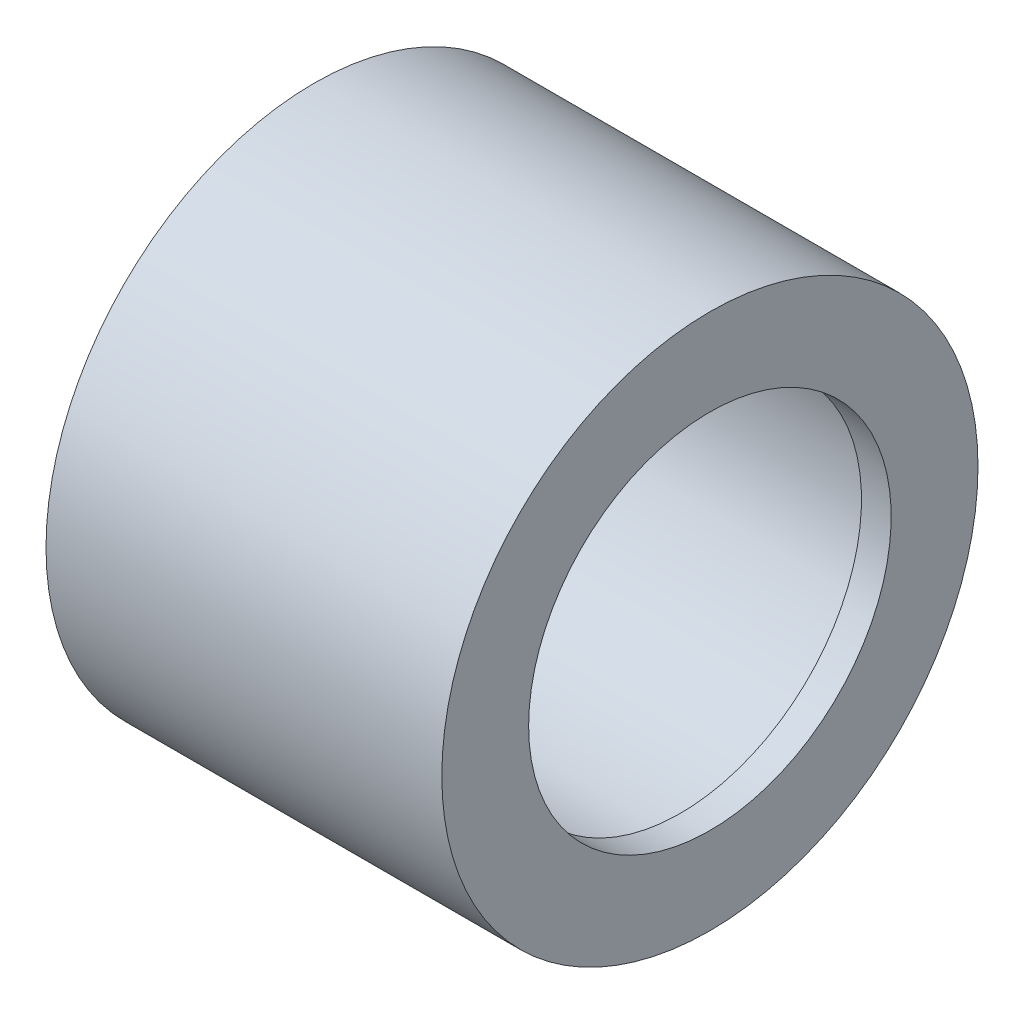
ISO-10303-21;
HEADER;
FILE_DESCRIPTION(('STEP AP214'),'2;1');
FILE_NAME('part.step','',(''),(''),'','','');
FILE_SCHEMA(('AUTOMOTIVE_DESIGN { 1 0 10303 214 1 1 1 1 }'));
ENDSEC;
DATA;
#1=APPLICATION_CONTEXT('core data for automotive mechanical design processes');
#2=APPLICATION_PROTOCOL_DEFINITION('international standard','automotive_design',2000,#1);
#3=PRODUCT_CONTEXT('',#1,'mechanical');
#4=PRODUCT('Part','Part','',(#3));
#5=PRODUCT_RELATED_PRODUCT_CATEGORY('part','',(#4));
#6=PRODUCT_DEFINITION_FORMATION('','',#4);
#7=PRODUCT_DEFINITION_CONTEXT('part definition',#1,'design');
#8=PRODUCT_DEFINITION('design','',#6,#7);
#9=PRODUCT_DEFINITION_SHAPE('','',#8);
#10=(LENGTH_UNIT() NAMED_UNIT(*) SI_UNIT(.MILLI.,.METRE.));
#11=(NAMED_UNIT(*) PLANE_ANGLE_UNIT() SI_UNIT($,.RADIAN.));
#12=(NAMED_UNIT(*) SI_UNIT($,.STERADIAN.) SOLID_ANGLE_UNIT());
#13=UNCERTAINTY_MEASURE_WITH_UNIT(LENGTH_MEASURE(1.E-05),#10,'distance_accuracy_value','');
#14=(GEOMETRIC_REPRESENTATION_CONTEXT(3) GLOBAL_UNCERTAINTY_ASSIGNED_CONTEXT((#13)) GLOBAL_UNIT_ASSIGNED_CONTEXT((#10,
#11,#12)) REPRESENTATION_CONTEXT('',''));
#15=CARTESIAN_POINT('',(0.,0.,0.));
#16=DIRECTION('',(0.,0.,1.));
#17=DIRECTION('',(1.,0.,0.));
#18=AXIS2_PLACEMENT_3D('',#15,#16,#17);
#19=CARTESIAN_POINT('',(0.,18.32,0.));
#20=DIRECTION('',(1.,0.,0.));
#21=DIRECTION('',(0.,0.,-1.));
#22=AXIS2_PLACEMENT_3D('',#19,#20,#21);
#23=PLANE('',#22);
#24=CARTESIAN_POINT('',(0.,0.,0.));
#25=DIRECTION('',(-1.,0.,0.));
#26=DIRECTION('',(0.,0.,1.));
#27=AXIS2_PLACEMENT_3D('',#24,#25,#26);
#28=CIRCLE('',#27,18.32);
#29=CARTESIAN_POINT('',(0.,0.,18.32));
#30=VERTEX_POINT('',#29);
#31=EDGE_CURVE('E60',#30,#30,#28,.T.);
#32=ORIENTED_EDGE('',*,*,#31,.F.);
#33=EDGE_LOOP('',(#32));
#34=FACE_BOUND('',#33,.T.);
#35=CARTESIAN_POINT('',(0.,0.,0.));
#36=DIRECTION('',(-1.,0.,0.));
#37=DIRECTION('',(0.,0.,1.));
#38=AXIS2_PLACEMENT_3D('',#35,#36,#37);
#39=CIRCLE('',#38,27.093088703214);
#40=CARTESIAN_POINT('',(0.,0.,27.093088703214));
#41=VERTEX_POINT('',#40);
#42=EDGE_CURVE('E10',#41,#41,#39,.T.);
#43=ORIENTED_EDGE('',*,*,#42,.T.);
#44=EDGE_LOOP('',(#43));
#45=FACE_BOUND('',#44,.T.);
#46=ADVANCED_FACE('F32',(#34,#45),#23,.F.);
#47=CARTESIAN_POINT('',(0.,0.,0.));
#48=DIRECTION('',(-1.,0.,0.));
#49=DIRECTION('',(0.,0.,1.));
#50=AXIS2_PLACEMENT_3D('',#47,#48,#49);
#51=CYLINDRICAL_SURFACE('',#50,27.093088703214);
#52=ORIENTED_EDGE('',*,*,#42,.F.);
#53=EDGE_LOOP('',(#52));
#54=FACE_BOUND('',#53,.T.);
#55=CARTESIAN_POINT('',(40.,0.,0.));
#56=DIRECTION('',(-1.,0.,0.));
#57=DIRECTION('',(0.,0.,1.));
#58=AXIS2_PLACEMENT_3D('',#55,#56,#57);
#59=CIRCLE('',#58,27.093088703214);
#60=CARTESIAN_POINT('',(40.,0.,27.093088703214));
#61=VERTEX_POINT('',#60);
#62=EDGE_CURVE('E38',#61,#61,#59,.T.);
#63=ORIENTED_EDGE('',*,*,#62,.T.);
#64=EDGE_LOOP('',(#63));
#65=FACE_BOUND('',#64,.T.);
#66=ADVANCED_FACE('F67',(#54,#65),#51,.T.);
#67=CARTESIAN_POINT('',(40.,27.093088703214,0.));
#68=DIRECTION('',(-1.,0.,0.));
#69=DIRECTION('',(0.,0.,1.));
#70=AXIS2_PLACEMENT_3D('',#67,#68,#69);
#71=PLANE('',#70);
#72=ORIENTED_EDGE('',*,*,#62,.F.);
#73=EDGE_LOOP('',(#72));
#74=FACE_BOUND('',#73,.T.);
#75=CARTESIAN_POINT('',(40.,0.,0.));
#76=DIRECTION('',(-1.,0.,0.));
#77=DIRECTION('',(0.,0.,1.));
#78=AXIS2_PLACEMENT_3D('',#75,#76,#77);
#79=CIRCLE('',#78,18.32);
#80=CARTESIAN_POINT('',(40.,0.,18.32));
#81=VERTEX_POINT('',#80);
#82=EDGE_CURVE('E42',#81,#81,#79,.T.);
#83=ORIENTED_EDGE('',*,*,#82,.T.);
#84=EDGE_LOOP('',(#83));
#85=FACE_BOUND('',#84,.T.);
#86=ADVANCED_FACE('F71',(#74,#85),#71,.F.);
#87=CARTESIAN_POINT('',(0.,0.,0.));
#88=DIRECTION('',(-1.,0.,0.));
#89=DIRECTION('',(0.,0.,1.));
#90=AXIS2_PLACEMENT_3D('',#87,#88,#89);
#91=CYLINDRICAL_SURFACE('',#90,18.32);
#92=ORIENTED_EDGE('',*,*,#82,.F.);
#93=EDGE_LOOP('',(#92));
#94=FACE_BOUND('',#93,.T.);
#95=CARTESIAN_POINT('',(37.,0.,0.));
#96=DIRECTION('',(-1.,0.,0.));
#97=DIRECTION('',(0.,0.,1.));
#98=AXIS2_PLACEMENT_3D('',#95,#96,#97);
#99=CIRCLE('',#98,18.32);
#100=CARTESIAN_POINT('',(37.,0.,18.32));
#101=VERTEX_POINT('',#100);
#102=EDGE_CURVE('E46',#101,#101,#99,.T.);
#103=ORIENTED_EDGE('',*,*,#102,.T.);
#104=EDGE_LOOP('',(#103));
#105=FACE_BOUND('',#104,.T.);
#106=ADVANCED_FACE('F76',(#94,#105),#91,.F.);
#107=CARTESIAN_POINT('',(37.,20.32,0.));
#108=DIRECTION('',(1.,0.,0.));
#109=DIRECTION('',(0.,0.,-1.));
#110=AXIS2_PLACEMENT_3D('',#107,#108,#109);
#111=PLANE('',#110);
#112=ORIENTED_EDGE('',*,*,#102,.F.);
#113=EDGE_LOOP('',(#112));
#114=FACE_BOUND('',#113,.T.);
#115=CARTESIAN_POINT('',(37.,0.,0.));
#116=DIRECTION('',(-1.,0.,0.));
#117=DIRECTION('',(0.,0.,1.));
#118=AXIS2_PLACEMENT_3D('',#115,#116,#117);
#119=CIRCLE('',#118,20.32);
#120=CARTESIAN_POINT('',(37.,0.,20.32));
#121=VERTEX_POINT('',#120);
#122=EDGE_CURVE('E51',#121,#121,#119,.T.);
#123=ORIENTED_EDGE('',*,*,#122,.T.);
#124=EDGE_LOOP('',(#123));
#125=FACE_BOUND('',#124,.T.);
#126=ADVANCED_FACE('F82',(#114,#125),#111,.F.);
#127=CARTESIAN_POINT('',(0.,0.,0.));
#128=DIRECTION('',(-1.,0.,0.));
#129=DIRECTION('',(0.,0.,1.));
#130=AXIS2_PLACEMENT_3D('',#127,#128,#129);
#131=CYLINDRICAL_SURFACE('',#130,20.32);
#132=ORIENTED_EDGE('',*,*,#122,.F.);
#133=EDGE_LOOP('',(#132));
#134=FACE_BOUND('',#133,.T.);
#135=CARTESIAN_POINT('',(3.00000000000001,0.,0.));
#136=DIRECTION('',(-1.,0.,0.));
#137=DIRECTION('',(0.,0.,1.));
#138=AXIS2_PLACEMENT_3D('',#135,#136,#137);
#139=CIRCLE('',#138,20.32);
#140=CARTESIAN_POINT('',(3.00000000000001,0.,20.32));
#141=VERTEX_POINT('',#140);
#142=EDGE_CURVE('E54',#141,#141,#139,.T.);
#143=ORIENTED_EDGE('',*,*,#142,.T.);
#144=EDGE_LOOP('',(#143));
#145=FACE_BOUND('',#144,.T.);
#146=ADVANCED_FACE('F86',(#134,#145),#131,.F.);
#147=CARTESIAN_POINT('',(3.,18.32,0.));
#148=DIRECTION('',(-1.,0.,0.));
#149=DIRECTION('',(0.,0.,1.));
#150=AXIS2_PLACEMENT_3D('',#147,#148,#149);
#151=PLANE('',#150);
#152=ORIENTED_EDGE('',*,*,#142,.F.);
#153=EDGE_LOOP('',(#152));
#154=FACE_BOUND('',#153,.T.);
#155=CARTESIAN_POINT('',(3.,0.,0.));
#156=DIRECTION('',(-1.,0.,0.));
#157=DIRECTION('',(0.,0.,1.));
#158=AXIS2_PLACEMENT_3D('',#155,#156,#157);
#159=CIRCLE('',#158,18.32);
#160=CARTESIAN_POINT('',(3.,0.,18.32));
#161=VERTEX_POINT('',#160);
#162=EDGE_CURVE('E57',#161,#161,#159,.T.);
#163=ORIENTED_EDGE('',*,*,#162,.T.);
#164=EDGE_LOOP('',(#163));
#165=FACE_BOUND('',#164,.T.);
#166=ADVANCED_FACE('F90',(#154,#165),#151,.F.);
#167=CARTESIAN_POINT('',(0.,0.,0.));
#168=DIRECTION('',(-1.,0.,0.));
#169=DIRECTION('',(0.,0.,1.));
#170=AXIS2_PLACEMENT_3D('',#167,#168,#169);
#171=CYLINDRICAL_SURFACE('',#170,18.32);
#172=ORIENTED_EDGE('',*,*,#162,.F.);
#173=EDGE_LOOP('',(#172));
#174=FACE_BOUND('',#173,.T.);
#175=ORIENTED_EDGE('',*,*,#31,.T.);
#176=EDGE_LOOP('',(#175));
#177=FACE_BOUND('',#176,.T.);
#178=ADVANCED_FACE('F64',(#174,#177),#171,.F.);
#179=CLOSED_SHELL('',(#46,#66,#86,#106,#126,#146,#166,#178));
#180=MANIFOLD_SOLID_BREP('B2',#179);
#181=ADVANCED_BREP_SHAPE_REPRESENTATION('',(#18,#180),#14);
#182=SHAPE_DEFINITION_REPRESENTATION(#9,#181);
ENDSEC;
END-ISO-10303-21;
